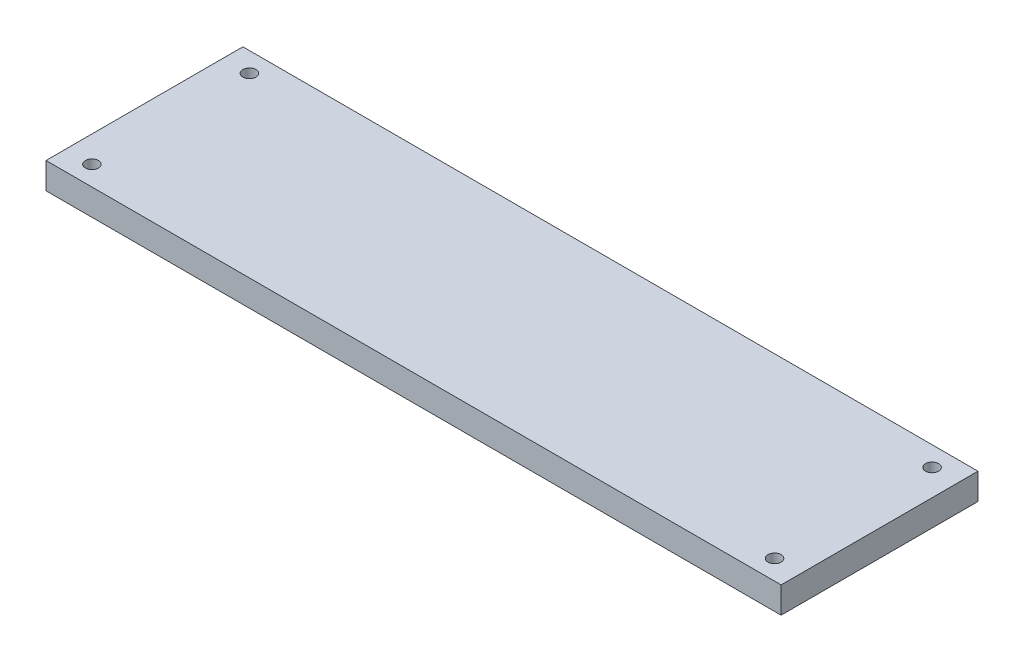
ISO-10303-21;
HEADER;
FILE_DESCRIPTION(('STEP AP214'),'2;1');
FILE_NAME('part.step','',(''),(''),'','','');
FILE_SCHEMA(('AUTOMOTIVE_DESIGN { 1 0 10303 214 1 1 1 1 }'));
ENDSEC;
DATA;
#1=APPLICATION_CONTEXT('core data for automotive mechanical design processes');
#2=APPLICATION_PROTOCOL_DEFINITION('international standard','automotive_design',2000,#1);
#3=PRODUCT_CONTEXT('',#1,'mechanical');
#4=PRODUCT('Part','Part','',(#3));
#5=PRODUCT_RELATED_PRODUCT_CATEGORY('part','',(#4));
#6=PRODUCT_DEFINITION_FORMATION('','',#4);
#7=PRODUCT_DEFINITION_CONTEXT('part definition',#1,'design');
#8=PRODUCT_DEFINITION('design','',#6,#7);
#9=PRODUCT_DEFINITION_SHAPE('','',#8);
#10=(LENGTH_UNIT() NAMED_UNIT(*) SI_UNIT(.MILLI.,.METRE.));
#11=(NAMED_UNIT(*) PLANE_ANGLE_UNIT() SI_UNIT($,.RADIAN.));
#12=(NAMED_UNIT(*) SI_UNIT($,.STERADIAN.) SOLID_ANGLE_UNIT());
#13=UNCERTAINTY_MEASURE_WITH_UNIT(LENGTH_MEASURE(1.E-05),#10,'distance_accuracy_value','');
#14=(GEOMETRIC_REPRESENTATION_CONTEXT(3) GLOBAL_UNCERTAINTY_ASSIGNED_CONTEXT((#13)) GLOBAL_UNIT_ASSIGNED_CONTEXT((#10,
#11,#12)) REPRESENTATION_CONTEXT('',''));
#15=CARTESIAN_POINT('',(0.,0.,0.));
#16=DIRECTION('',(0.,0.,1.));
#17=DIRECTION('',(1.,0.,0.));
#18=AXIS2_PLACEMENT_3D('',#15,#16,#17);
#19=CARTESIAN_POINT('',(177.8,12.7,-47.625));
#20=DIRECTION('',(-1.,0.,0.));
#21=DIRECTION('',(0.,0.,1.));
#22=AXIS2_PLACEMENT_3D('',#19,#20,#21);
#23=PLANE('',#22);
#24=DIRECTION('',(0.,0.,-1.));
#25=VECTOR('',#24,1.);
#26=CARTESIAN_POINT('',(177.8,0.,-47.625));
#27=LINE('',#26,#25);
#28=CARTESIAN_POINT('',(177.8,0.,47.625));
#29=VERTEX_POINT('',#28);
#30=CARTESIAN_POINT('',(177.8,0.,-47.625));
#31=VERTEX_POINT('',#30);
#32=EDGE_CURVE('E96',#29,#31,#27,.T.);
#33=ORIENTED_EDGE('',*,*,#32,.T.);
#34=DIRECTION('',(0.,-1.,0.));
#35=VECTOR('',#34,1.);
#36=CARTESIAN_POINT('',(177.8,12.7,-47.625));
#37=LINE('',#36,#35);
#38=CARTESIAN_POINT('',(177.8,12.7,-47.625));
#39=VERTEX_POINT('',#38);
#40=EDGE_CURVE('E11',#39,#31,#37,.T.);
#41=ORIENTED_EDGE('',*,*,#40,.F.);
#42=DIRECTION('',(0.,0.,-1.));
#43=VECTOR('',#42,1.);
#44=CARTESIAN_POINT('',(177.8,12.7,-47.625));
#45=LINE('',#44,#43);
#46=CARTESIAN_POINT('',(177.8,12.7,47.625));
#47=VERTEX_POINT('',#46);
#48=EDGE_CURVE('E84',#47,#39,#45,.T.);
#49=ORIENTED_EDGE('',*,*,#48,.F.);
#50=DIRECTION('',(0.,-1.,0.));
#51=VECTOR('',#50,1.);
#52=CARTESIAN_POINT('',(177.8,12.7,47.625));
#53=LINE('',#52,#51);
#54=EDGE_CURVE('E92',#47,#29,#53,.T.);
#55=ORIENTED_EDGE('',*,*,#54,.T.);
#56=EDGE_LOOP('',(#33,#41,#49,#55));
#57=FACE_BOUND('',#56,.T.);
#58=ADVANCED_FACE('F33',(#57),#23,.F.);
#59=CARTESIAN_POINT('',(-177.8,12.7,-47.625));
#60=DIRECTION('',(0.,0.,1.));
#61=DIRECTION('',(1.,0.,0.));
#62=AXIS2_PLACEMENT_3D('',#59,#60,#61);
#63=PLANE('',#62);
#64=DIRECTION('',(-1.,0.,0.));
#65=VECTOR('',#64,1.);
#66=CARTESIAN_POINT('',(-177.8,0.,-47.625));
#67=LINE('',#66,#65);
#68=CARTESIAN_POINT('',(-177.8,0.,-47.625));
#69=VERTEX_POINT('',#68);
#70=EDGE_CURVE('E88',#31,#69,#67,.T.);
#71=ORIENTED_EDGE('',*,*,#70,.T.);
#72=DIRECTION('',(0.,-1.,0.));
#73=VECTOR('',#72,1.);
#74=CARTESIAN_POINT('',(-177.8,12.7,-47.625));
#75=LINE('',#74,#73);
#76=CARTESIAN_POINT('',(-177.8,12.7,-47.625));
#77=VERTEX_POINT('',#76);
#78=EDGE_CURVE('E41',#77,#69,#75,.T.);
#79=ORIENTED_EDGE('',*,*,#78,.F.);
#80=DIRECTION('',(-1.,0.,0.));
#81=VECTOR('',#80,1.);
#82=CARTESIAN_POINT('',(-177.8,12.7,-47.625));
#83=LINE('',#82,#81);
#84=EDGE_CURVE('E79',#39,#77,#83,.T.);
#85=ORIENTED_EDGE('',*,*,#84,.F.);
#86=ORIENTED_EDGE('',*,*,#40,.T.);
#87=EDGE_LOOP('',(#71,#79,#85,#86));
#88=FACE_BOUND('',#87,.T.);
#89=ADVANCED_FACE('F87',(#88),#63,.F.);
#90=CARTESIAN_POINT('',(-177.8,12.7,-47.625));
#91=DIRECTION('',(1.,0.,0.));
#92=DIRECTION('',(0.,0.,-1.));
#93=AXIS2_PLACEMENT_3D('',#90,#91,#92);
#94=PLANE('',#93);
#95=DIRECTION('',(0.,0.,1.));
#96=VECTOR('',#95,1.);
#97=CARTESIAN_POINT('',(-177.8,0.,-47.625));
#98=LINE('',#97,#96);
#99=CARTESIAN_POINT('',(-177.8,0.,47.625));
#100=VERTEX_POINT('',#99);
#101=EDGE_CURVE('E66',#69,#100,#98,.T.);
#102=ORIENTED_EDGE('',*,*,#101,.T.);
#103=DIRECTION('',(0.,-1.,0.));
#104=VECTOR('',#103,1.);
#105=CARTESIAN_POINT('',(-177.8,12.7,47.625));
#106=LINE('',#105,#104);
#107=CARTESIAN_POINT('',(-177.8,12.7,47.625));
#108=VERTEX_POINT('',#107);
#109=EDGE_CURVE('E89',#108,#100,#106,.T.);
#110=ORIENTED_EDGE('',*,*,#109,.F.);
#111=DIRECTION('',(0.,0.,1.));
#112=VECTOR('',#111,1.);
#113=CARTESIAN_POINT('',(-177.8,12.7,-47.625));
#114=LINE('',#113,#112);
#115=EDGE_CURVE('E82',#77,#108,#114,.T.);
#116=ORIENTED_EDGE('',*,*,#115,.F.);
#117=ORIENTED_EDGE('',*,*,#78,.T.);
#118=EDGE_LOOP('',(#102,#110,#116,#117));
#119=FACE_BOUND('',#118,.T.);
#120=ADVANCED_FACE('F90',(#119),#94,.F.);
#121=CARTESIAN_POINT('',(-177.8,12.7,47.625));
#122=DIRECTION('',(0.,0.,-1.));
#123=DIRECTION('',(-1.,0.,0.));
#124=AXIS2_PLACEMENT_3D('',#121,#122,#123);
#125=PLANE('',#124);
#126=DIRECTION('',(1.,0.,0.));
#127=VECTOR('',#126,1.);
#128=CARTESIAN_POINT('',(-177.8,0.,47.625));
#129=LINE('',#128,#127);
#130=EDGE_CURVE('E72',#100,#29,#129,.T.);
#131=ORIENTED_EDGE('',*,*,#130,.T.);
#132=ORIENTED_EDGE('',*,*,#54,.F.);
#133=DIRECTION('',(1.,0.,0.));
#134=VECTOR('',#133,1.);
#135=CARTESIAN_POINT('',(-177.8,12.7,47.625));
#136=LINE('',#135,#134);
#137=EDGE_CURVE('E49',#108,#47,#136,.T.);
#138=ORIENTED_EDGE('',*,*,#137,.F.);
#139=ORIENTED_EDGE('',*,*,#109,.T.);
#140=EDGE_LOOP('',(#131,#132,#138,#139));
#141=FACE_BOUND('',#140,.T.);
#142=ADVANCED_FACE('F104',(#141),#125,.F.);
#143=CARTESIAN_POINT('',(0.,12.7,0.));
#144=DIRECTION('',(0.,1.,0.));
#145=DIRECTION('',(0.,0.,1.));
#146=AXIS2_PLACEMENT_3D('',#143,#144,#145);
#147=PLANE('',#146);
#148=CARTESIAN_POINT('',(-165.1,12.7,-38.1));
#149=DIRECTION('',(0.,1.,0.));
#150=DIRECTION('',(0.,0.,-1.));
#151=AXIS2_PLACEMENT_3D('',#148,#149,#150);
#152=CIRCLE('',#151,3.175);
#153=CARTESIAN_POINT('',(-165.1,12.7,-41.275));
#154=VERTEX_POINT('',#153);
#155=EDGE_CURVE('E123',#154,#154,#152,.T.);
#156=ORIENTED_EDGE('',*,*,#155,.F.);
#157=EDGE_LOOP('',(#156));
#158=FACE_BOUND('',#157,.T.);
#159=CARTESIAN_POINT('',(165.1,12.7,38.1));
#160=DIRECTION('',(0.,1.,0.));
#161=DIRECTION('',(0.,0.,-1.));
#162=AXIS2_PLACEMENT_3D('',#159,#160,#161);
#163=CIRCLE('',#162,3.175);
#164=CARTESIAN_POINT('',(165.1,12.7,34.925));
#165=VERTEX_POINT('',#164);
#166=EDGE_CURVE('E116',#165,#165,#163,.T.);
#167=ORIENTED_EDGE('',*,*,#166,.F.);
#168=EDGE_LOOP('',(#167));
#169=FACE_BOUND('',#168,.T.);
#170=CARTESIAN_POINT('',(-165.1,12.7,38.1));
#171=DIRECTION('',(0.,1.,0.));
#172=DIRECTION('',(0.,0.,1.));
#173=AXIS2_PLACEMENT_3D('',#170,#171,#172);
#174=CIRCLE('',#173,3.175);
#175=CARTESIAN_POINT('',(-165.1,12.7,41.275));
#176=VERTEX_POINT('',#175);
#177=EDGE_CURVE('E128',#176,#176,#174,.T.);
#178=ORIENTED_EDGE('',*,*,#177,.F.);
#179=EDGE_LOOP('',(#178));
#180=FACE_BOUND('',#179,.T.);
#181=CARTESIAN_POINT('',(165.1,12.7,-38.1));
#182=DIRECTION('',(0.,1.,0.));
#183=DIRECTION('',(0.,0.,1.));
#184=AXIS2_PLACEMENT_3D('',#181,#182,#183);
#185=CIRCLE('',#184,3.175);
#186=CARTESIAN_POINT('',(165.1,12.7,-34.925));
#187=VERTEX_POINT('',#186);
#188=EDGE_CURVE('E110',#187,#187,#185,.T.);
#189=ORIENTED_EDGE('',*,*,#188,.F.);
#190=EDGE_LOOP('',(#189));
#191=FACE_BOUND('',#190,.T.);
#192=ORIENTED_EDGE('',*,*,#48,.T.);
#193=ORIENTED_EDGE('',*,*,#84,.T.);
#194=ORIENTED_EDGE('',*,*,#115,.T.);
#195=ORIENTED_EDGE('',*,*,#137,.T.);
#196=EDGE_LOOP('',(#192,#193,#194,#195));
#197=FACE_BOUND('',#196,.T.);
#198=ADVANCED_FACE('F80',(#158,#169,#180,#191,#197),#147,.T.);
#199=CARTESIAN_POINT('',(0.,0.,0.));
#200=DIRECTION('',(0.,1.,0.));
#201=DIRECTION('',(0.,0.,1.));
#202=AXIS2_PLACEMENT_3D('',#199,#200,#201);
#203=PLANE('',#202);
#204=CARTESIAN_POINT('',(-165.1,0.,-38.1));
#205=DIRECTION('',(0.,1.,0.));
#206=DIRECTION('',(0.,0.,-1.));
#207=AXIS2_PLACEMENT_3D('',#204,#205,#206);
#208=CIRCLE('',#207,3.175);
#209=CARTESIAN_POINT('',(-165.1,0.,-41.275));
#210=VERTEX_POINT('',#209);
#211=EDGE_CURVE('E113',#210,#210,#208,.T.);
#212=ORIENTED_EDGE('',*,*,#211,.T.);
#213=EDGE_LOOP('',(#212));
#214=FACE_BOUND('',#213,.T.);
#215=CARTESIAN_POINT('',(165.1,0.,38.1));
#216=DIRECTION('',(0.,1.,0.));
#217=DIRECTION('',(0.,0.,-1.));
#218=AXIS2_PLACEMENT_3D('',#215,#216,#217);
#219=CIRCLE('',#218,3.175);
#220=CARTESIAN_POINT('',(165.1,0.,34.925));
#221=VERTEX_POINT('',#220);
#222=EDGE_CURVE('E119',#221,#221,#219,.T.);
#223=ORIENTED_EDGE('',*,*,#222,.T.);
#224=EDGE_LOOP('',(#223));
#225=FACE_BOUND('',#224,.T.);
#226=CARTESIAN_POINT('',(-165.1,0.,38.1));
#227=DIRECTION('',(0.,1.,0.));
#228=DIRECTION('',(0.,0.,1.));
#229=AXIS2_PLACEMENT_3D('',#226,#227,#228);
#230=CIRCLE('',#229,3.175);
#231=CARTESIAN_POINT('',(-165.1,0.,41.275));
#232=VERTEX_POINT('',#231);
#233=EDGE_CURVE('E120',#232,#232,#230,.T.);
#234=ORIENTED_EDGE('',*,*,#233,.T.);
#235=EDGE_LOOP('',(#234));
#236=FACE_BOUND('',#235,.T.);
#237=CARTESIAN_POINT('',(165.1,0.,-38.1));
#238=DIRECTION('',(0.,1.,0.));
#239=DIRECTION('',(0.,0.,1.));
#240=AXIS2_PLACEMENT_3D('',#237,#238,#239);
#241=CIRCLE('',#240,3.175);
#242=CARTESIAN_POINT('',(165.1,0.,-34.925));
#243=VERTEX_POINT('',#242);
#244=EDGE_CURVE('E99',#243,#243,#241,.T.);
#245=ORIENTED_EDGE('',*,*,#244,.T.);
#246=EDGE_LOOP('',(#245));
#247=FACE_BOUND('',#246,.T.);
#248=ORIENTED_EDGE('',*,*,#32,.F.);
#249=ORIENTED_EDGE('',*,*,#130,.F.);
#250=ORIENTED_EDGE('',*,*,#101,.F.);
#251=ORIENTED_EDGE('',*,*,#70,.F.);
#252=EDGE_LOOP('',(#248,#249,#250,#251));
#253=FACE_BOUND('',#252,.T.);
#254=ADVANCED_FACE('F107',(#214,#225,#236,#247,#253),#203,.F.);
#255=CARTESIAN_POINT('',(165.1,0.,-38.1));
#256=DIRECTION('',(0.,1.,0.));
#257=DIRECTION('',(0.,0.,1.));
#258=AXIS2_PLACEMENT_3D('',#255,#256,#257);
#259=CYLINDRICAL_SURFACE('',#258,3.175);
#260=ORIENTED_EDGE('',*,*,#244,.F.);
#261=EDGE_LOOP('',(#260));
#262=FACE_BOUND('',#261,.T.);
#263=ORIENTED_EDGE('',*,*,#188,.T.);
#264=EDGE_LOOP('',(#263));
#265=FACE_BOUND('',#264,.T.);
#266=ADVANCED_FACE('F140',(#262,#265),#259,.F.);
#267=CARTESIAN_POINT('',(-165.1,0.,38.1));
#268=DIRECTION('',(0.,1.,0.));
#269=DIRECTION('',(0.,0.,1.));
#270=AXIS2_PLACEMENT_3D('',#267,#268,#269);
#271=CYLINDRICAL_SURFACE('',#270,3.175);
#272=ORIENTED_EDGE('',*,*,#233,.F.);
#273=EDGE_LOOP('',(#272));
#274=FACE_BOUND('',#273,.T.);
#275=ORIENTED_EDGE('',*,*,#177,.T.);
#276=EDGE_LOOP('',(#275));
#277=FACE_BOUND('',#276,.T.);
#278=ADVANCED_FACE('F136',(#274,#277),#271,.F.);
#279=CARTESIAN_POINT('',(165.1,0.,38.1));
#280=DIRECTION('',(0.,1.,0.));
#281=DIRECTION('',(0.,0.,1.));
#282=AXIS2_PLACEMENT_3D('',#279,#280,#281);
#283=CYLINDRICAL_SURFACE('',#282,3.175);
#284=ORIENTED_EDGE('',*,*,#222,.F.);
#285=EDGE_LOOP('',(#284));
#286=FACE_BOUND('',#285,.T.);
#287=ORIENTED_EDGE('',*,*,#166,.T.);
#288=EDGE_LOOP('',(#287));
#289=FACE_BOUND('',#288,.T.);
#290=ADVANCED_FACE('F139',(#286,#289),#283,.F.);
#291=CARTESIAN_POINT('',(-165.1,0.,-38.1));
#292=DIRECTION('',(0.,1.,0.));
#293=DIRECTION('',(0.,0.,1.));
#294=AXIS2_PLACEMENT_3D('',#291,#292,#293);
#295=CYLINDRICAL_SURFACE('',#294,3.175);
#296=ORIENTED_EDGE('',*,*,#211,.F.);
#297=EDGE_LOOP('',(#296));
#298=FACE_BOUND('',#297,.T.);
#299=ORIENTED_EDGE('',*,*,#155,.T.);
#300=EDGE_LOOP('',(#299));
#301=FACE_BOUND('',#300,.T.);
#302=ADVANCED_FACE('F201',(#298,#301),#295,.F.);
#303=CLOSED_SHELL('',(#58,#89,#120,#142,#198,#254,#266,#278,#290,#302));
#304=MANIFOLD_SOLID_BREP('B2',#303);
#305=ADVANCED_BREP_SHAPE_REPRESENTATION('',(#18,#304),#14);
#306=SHAPE_DEFINITION_REPRESENTATION(#9,#305);
ENDSEC;
END-ISO-10303-21;
